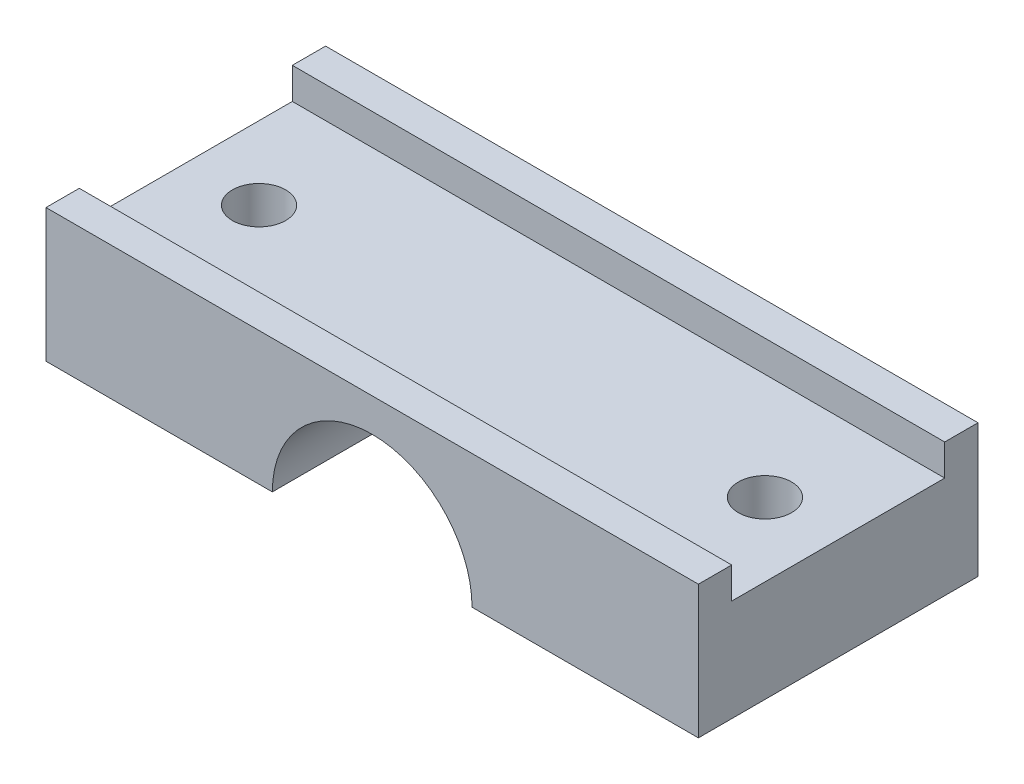
ISO-10303-21;
HEADER;
FILE_DESCRIPTION(('STEP AP214'),'2;1');
FILE_NAME('part.step','',(''),(''),'','','');
FILE_SCHEMA(('AUTOMOTIVE_DESIGN { 1 0 10303 214 1 1 1 1 }'));
ENDSEC;
DATA;
#1=APPLICATION_CONTEXT('core data for automotive mechanical design processes');
#2=APPLICATION_PROTOCOL_DEFINITION('international standard','automotive_design',2000,#1);
#3=PRODUCT_CONTEXT('',#1,'mechanical');
#4=PRODUCT('Part','Part','',(#3));
#5=PRODUCT_RELATED_PRODUCT_CATEGORY('part','',(#4));
#6=PRODUCT_DEFINITION_FORMATION('','',#4);
#7=PRODUCT_DEFINITION_CONTEXT('part definition',#1,'design');
#8=PRODUCT_DEFINITION('design','',#6,#7);
#9=PRODUCT_DEFINITION_SHAPE('','',#8);
#10=(LENGTH_UNIT() NAMED_UNIT(*) SI_UNIT(.MILLI.,.METRE.));
#11=(NAMED_UNIT(*) PLANE_ANGLE_UNIT() SI_UNIT($,.RADIAN.));
#12=(NAMED_UNIT(*) SI_UNIT($,.STERADIAN.) SOLID_ANGLE_UNIT());
#13=UNCERTAINTY_MEASURE_WITH_UNIT(LENGTH_MEASURE(1.E-05),#10,'distance_accuracy_value','');
#14=(GEOMETRIC_REPRESENTATION_CONTEXT(3) GLOBAL_UNCERTAINTY_ASSIGNED_CONTEXT((#13)) GLOBAL_UNIT_ASSIGNED_CONTEXT((#10,
#11,#12)) REPRESENTATION_CONTEXT('',''));
#15=CARTESIAN_POINT('',(0.,0.,0.));
#16=DIRECTION('',(0.,0.,1.));
#17=DIRECTION('',(1.,0.,0.));
#18=AXIS2_PLACEMENT_3D('',#15,#16,#17);
#19=CARTESIAN_POINT('',(0.,0.,42.));
#20=DIRECTION('',(0.,1.,0.));
#21=DIRECTION('',(0.,0.,1.));
#22=AXIS2_PLACEMENT_3D('',#19,#20,#21);
#23=PLANE('',#22);
#24=CARTESIAN_POINT('',(11.,0.,21.));
#25=DIRECTION('',(0.,1.,0.));
#26=DIRECTION('',(0.,0.,1.));
#27=AXIS2_PLACEMENT_3D('',#24,#25,#26);
#28=CIRCLE('',#27,4.);
#29=CARTESIAN_POINT('',(11.,0.,25.));
#30=VERTEX_POINT('',#29);
#31=EDGE_CURVE('E222',#30,#30,#28,.T.);
#32=ORIENTED_EDGE('',*,*,#31,.T.);
#33=EDGE_LOOP('',(#32));
#34=FACE_BOUND('',#33,.T.);
#35=DIRECTION('',(1.,0.,0.));
#36=VECTOR('',#35,1.);
#37=CARTESIAN_POINT('',(0.,0.,0.));
#38=LINE('',#37,#36);
#39=CARTESIAN_POINT('',(0.,0.,0.));
#40=VERTEX_POINT('',#39);
#41=CARTESIAN_POINT('',(34.,0.,0.));
#42=VERTEX_POINT('',#41);
#43=EDGE_CURVE('E140',#40,#42,#38,.T.);
#44=ORIENTED_EDGE('',*,*,#43,.T.);
#45=DIRECTION('',(0.,0.,1.));
#46=VECTOR('',#45,1.);
#47=CARTESIAN_POINT('',(34.,0.,0.));
#48=LINE('',#47,#46);
#49=CARTESIAN_POINT('',(34.,0.,42.));
#50=VERTEX_POINT('',#49);
#51=EDGE_CURVE('E54',#42,#50,#48,.T.);
#52=ORIENTED_EDGE('',*,*,#51,.T.);
#53=DIRECTION('',(1.,0.,0.));
#54=VECTOR('',#53,1.);
#55=CARTESIAN_POINT('',(0.,0.,42.));
#56=LINE('',#55,#54);
#57=CARTESIAN_POINT('',(0.,0.,42.));
#58=VERTEX_POINT('',#57);
#59=EDGE_CURVE('E179',#58,#50,#56,.T.);
#60=ORIENTED_EDGE('',*,*,#59,.F.);
#61=DIRECTION('',(0.,0.,-1.));
#62=VECTOR('',#61,1.);
#63=CARTESIAN_POINT('',(0.,0.,42.));
#64=LINE('',#63,#62);
#65=EDGE_CURVE('E11',#58,#40,#64,.T.);
#66=ORIENTED_EDGE('',*,*,#65,.T.);
#67=EDGE_LOOP('',(#44,#52,#60,#66));
#68=FACE_BOUND('',#67,.T.);
#69=ADVANCED_FACE('F38',(#34,#68),#23,.F.);
#70=CARTESIAN_POINT('',(64.,0.,42.));
#71=VERTEX_POINT('',#70);
#72=CARTESIAN_POINT('',(98.,0.,42.));
#73=VERTEX_POINT('',#72);
#74=EDGE_CURVE('E131',#71,#73,#56,.T.);
#75=ORIENTED_EDGE('',*,*,#74,.F.);
#76=DIRECTION('',(0.,0.,1.));
#77=VECTOR('',#76,1.);
#78=CARTESIAN_POINT('',(64.,0.,0.));
#79=LINE('',#78,#77);
#80=CARTESIAN_POINT('',(64.,0.,0.));
#81=VERTEX_POINT('',#80);
#82=EDGE_CURVE('E116',#71,#81,#79,.F.);
#83=ORIENTED_EDGE('',*,*,#82,.T.);
#84=CARTESIAN_POINT('',(98.,0.,0.));
#85=VERTEX_POINT('',#84);
#86=EDGE_CURVE('E129',#81,#85,#38,.T.);
#87=ORIENTED_EDGE('',*,*,#86,.T.);
#88=DIRECTION('',(0.,0.,-1.));
#89=VECTOR('',#88,1.);
#90=CARTESIAN_POINT('',(98.,0.,42.));
#91=LINE('',#90,#89);
#92=EDGE_CURVE('E47',#73,#85,#91,.T.);
#93=ORIENTED_EDGE('',*,*,#92,.F.);
#94=EDGE_LOOP('',(#75,#83,#87,#93));
#95=FACE_BOUND('',#94,.T.);
#96=CARTESIAN_POINT('',(87.,0.,21.));
#97=DIRECTION('',(0.,-1.,0.));
#98=DIRECTION('',(0.,0.,-1.));
#99=AXIS2_PLACEMENT_3D('',#96,#97,#98);
#100=CIRCLE('',#99,3.99999999999999);
#101=CARTESIAN_POINT('',(87.,0.,17.));
#102=VERTEX_POINT('',#101);
#103=EDGE_CURVE('E214',#102,#102,#100,.T.);
#104=ORIENTED_EDGE('',*,*,#103,.F.);
#105=EDGE_LOOP('',(#104));
#106=FACE_BOUND('',#105,.T.);
#107=ADVANCED_FACE('F126',(#95,#106),#23,.F.);
#108=CARTESIAN_POINT('',(0.,15.3,0.));
#109=DIRECTION('',(0.,-1.,0.));
#110=DIRECTION('',(0.,0.,-1.));
#111=AXIS2_PLACEMENT_3D('',#108,#109,#110);
#112=PLANE('',#111);
#113=CARTESIAN_POINT('',(11.,15.3,21.));
#114=DIRECTION('',(0.,1.,0.));
#115=DIRECTION('',(0.,0.,1.));
#116=AXIS2_PLACEMENT_3D('',#113,#114,#115);
#117=CIRCLE('',#116,4.);
#118=CARTESIAN_POINT('',(11.,15.3,25.));
#119=VERTEX_POINT('',#118);
#120=EDGE_CURVE('E226',#119,#119,#117,.T.);
#121=ORIENTED_EDGE('',*,*,#120,.F.);
#122=EDGE_LOOP('',(#121));
#123=FACE_BOUND('',#122,.T.);
#124=DIRECTION('',(0.,0.,-1.));
#125=VECTOR('',#124,1.);
#126=CARTESIAN_POINT('',(98.,15.3,0.));
#127=LINE('',#126,#125);
#128=CARTESIAN_POINT('',(98.,15.3,37.));
#129=VERTEX_POINT('',#128);
#130=CARTESIAN_POINT('',(98.,15.3,5.));
#131=VERTEX_POINT('',#130);
#132=EDGE_CURVE('E202',#129,#131,#127,.T.);
#133=ORIENTED_EDGE('',*,*,#132,.T.);
#134=DIRECTION('',(1.,0.,0.));
#135=VECTOR('',#134,1.);
#136=CARTESIAN_POINT('',(0.,15.3,5.));
#137=LINE('',#136,#135);
#138=CARTESIAN_POINT('',(0.,15.3,5.));
#139=VERTEX_POINT('',#138);
#140=EDGE_CURVE('E146',#139,#131,#137,.T.);
#141=ORIENTED_EDGE('',*,*,#140,.F.);
#142=DIRECTION('',(0.,0.,-1.));
#143=VECTOR('',#142,1.);
#144=CARTESIAN_POINT('',(0.,15.3,0.));
#145=LINE('',#144,#143);
#146=CARTESIAN_POINT('',(0.,15.3,37.));
#147=VERTEX_POINT('',#146);
#148=EDGE_CURVE('E194',#147,#139,#145,.T.);
#149=ORIENTED_EDGE('',*,*,#148,.F.);
#150=DIRECTION('',(1.,0.,0.));
#151=VECTOR('',#150,1.);
#152=CARTESIAN_POINT('',(0.,15.3,37.));
#153=LINE('',#152,#151);
#154=EDGE_CURVE('E197',#147,#129,#153,.T.);
#155=ORIENTED_EDGE('',*,*,#154,.T.);
#156=EDGE_LOOP('',(#133,#141,#149,#155));
#157=FACE_BOUND('',#156,.T.);
#158=CARTESIAN_POINT('',(87.,15.3,21.));
#159=DIRECTION('',(0.,-1.,0.));
#160=DIRECTION('',(0.,0.,-1.));
#161=AXIS2_PLACEMENT_3D('',#158,#159,#160);
#162=CIRCLE('',#161,3.99999999999999);
#163=CARTESIAN_POINT('',(87.,15.3,17.));
#164=VERTEX_POINT('',#163);
#165=EDGE_CURVE('E230',#164,#164,#162,.T.);
#166=ORIENTED_EDGE('',*,*,#165,.T.);
#167=EDGE_LOOP('',(#166));
#168=FACE_BOUND('',#167,.T.);
#169=ADVANCED_FACE('F259',(#123,#157,#168),#112,.F.);
#170=CARTESIAN_POINT('',(0.,0.,42.));
#171=DIRECTION('',(1.,0.,0.));
#172=DIRECTION('',(0.,0.,-1.));
#173=AXIS2_PLACEMENT_3D('',#170,#171,#172);
#174=PLANE('',#173);
#175=DIRECTION('',(0.,-1.,0.));
#176=VECTOR('',#175,1.);
#177=CARTESIAN_POINT('',(0.,0.,4.99999999999999));
#178=LINE('',#177,#176);
#179=CARTESIAN_POINT('',(0.,20.,5.));
#180=VERTEX_POINT('',#179);
#181=EDGE_CURVE('E206',#180,#139,#178,.T.);
#182=ORIENTED_EDGE('',*,*,#181,.F.);
#183=DIRECTION('',(0.,0.,-1.));
#184=VECTOR('',#183,1.);
#185=CARTESIAN_POINT('',(0.,20.,42.));
#186=LINE('',#185,#184);
#187=CARTESIAN_POINT('',(0.,20.,0.));
#188=VERTEX_POINT('',#187);
#189=EDGE_CURVE('E162',#180,#188,#186,.T.);
#190=ORIENTED_EDGE('',*,*,#189,.T.);
#191=DIRECTION('',(0.,-1.,0.));
#192=VECTOR('',#191,1.);
#193=CARTESIAN_POINT('',(0.,0.,0.));
#194=LINE('',#193,#192);
#195=EDGE_CURVE('E141',#188,#40,#194,.T.);
#196=ORIENTED_EDGE('',*,*,#195,.T.);
#197=ORIENTED_EDGE('',*,*,#65,.F.);
#198=DIRECTION('',(0.,-1.,0.));
#199=VECTOR('',#198,1.);
#200=CARTESIAN_POINT('',(0.,0.,42.));
#201=LINE('',#200,#199);
#202=CARTESIAN_POINT('',(0.,20.,42.));
#203=VERTEX_POINT('',#202);
#204=EDGE_CURVE('E156',#203,#58,#201,.T.);
#205=ORIENTED_EDGE('',*,*,#204,.F.);
#206=CARTESIAN_POINT('',(0.,20.,37.));
#207=VERTEX_POINT('',#206);
#208=EDGE_CURVE('E157',#203,#207,#186,.T.);
#209=ORIENTED_EDGE('',*,*,#208,.T.);
#210=DIRECTION('',(0.,-1.,0.));
#211=VECTOR('',#210,1.);
#212=CARTESIAN_POINT('',(0.,-1.09250669976412E-13,36.9999999999999));
#213=LINE('',#212,#211);
#214=EDGE_CURVE('E62',#207,#147,#213,.T.);
#215=ORIENTED_EDGE('',*,*,#214,.T.);
#216=ORIENTED_EDGE('',*,*,#148,.T.);
#217=EDGE_LOOP('',(#182,#190,#196,#197,#205,#209,#215,#216));
#218=FACE_BOUND('',#217,.T.);
#219=ADVANCED_FACE('F40',(#218),#174,.F.);
#220=CARTESIAN_POINT('',(98.,0.,42.));
#221=DIRECTION('',(-1.,0.,0.));
#222=DIRECTION('',(0.,0.,1.));
#223=AXIS2_PLACEMENT_3D('',#220,#221,#222);
#224=PLANE('',#223);
#225=DIRECTION('',(0.,-1.,0.));
#226=VECTOR('',#225,1.);
#227=CARTESIAN_POINT('',(98.,0.,4.99999999999999));
#228=LINE('',#227,#226);
#229=CARTESIAN_POINT('',(98.,20.,5.));
#230=VERTEX_POINT('',#229);
#231=EDGE_CURVE('E211',#230,#131,#228,.T.);
#232=ORIENTED_EDGE('',*,*,#231,.T.);
#233=ORIENTED_EDGE('',*,*,#132,.F.);
#234=DIRECTION('',(0.,-1.,0.));
#235=VECTOR('',#234,1.);
#236=CARTESIAN_POINT('',(98.,-1.09250669976412E-13,36.9999999999999));
#237=LINE('',#236,#235);
#238=CARTESIAN_POINT('',(98.,20.,37.));
#239=VERTEX_POINT('',#238);
#240=EDGE_CURVE('E207',#239,#129,#237,.T.);
#241=ORIENTED_EDGE('',*,*,#240,.F.);
#242=DIRECTION('',(0.,0.,-1.));
#243=VECTOR('',#242,1.);
#244=CARTESIAN_POINT('',(98.,20.,42.));
#245=LINE('',#244,#243);
#246=CARTESIAN_POINT('',(98.,20.,42.));
#247=VERTEX_POINT('',#246);
#248=EDGE_CURVE('E163',#247,#239,#245,.T.);
#249=ORIENTED_EDGE('',*,*,#248,.F.);
#250=DIRECTION('',(0.,1.,0.));
#251=VECTOR('',#250,1.);
#252=CARTESIAN_POINT('',(98.,0.,42.));
#253=LINE('',#252,#251);
#254=EDGE_CURVE('E173',#73,#247,#253,.T.);
#255=ORIENTED_EDGE('',*,*,#254,.F.);
#256=ORIENTED_EDGE('',*,*,#92,.T.);
#257=DIRECTION('',(0.,1.,0.));
#258=VECTOR('',#257,1.);
#259=CARTESIAN_POINT('',(98.,0.,0.));
#260=LINE('',#259,#258);
#261=CARTESIAN_POINT('',(98.,20.,0.));
#262=VERTEX_POINT('',#261);
#263=EDGE_CURVE('E138',#85,#262,#260,.T.);
#264=ORIENTED_EDGE('',*,*,#263,.T.);
#265=EDGE_CURVE('E161',#230,#262,#245,.T.);
#266=ORIENTED_EDGE('',*,*,#265,.F.);
#267=EDGE_LOOP('',(#232,#233,#241,#249,#255,#256,#264,#266));
#268=FACE_BOUND('',#267,.T.);
#269=ADVANCED_FACE('F170',(#268),#224,.F.);
#270=CARTESIAN_POINT('',(0.,20.,42.));
#271=DIRECTION('',(0.,-1.,0.));
#272=DIRECTION('',(0.,0.,-1.));
#273=AXIS2_PLACEMENT_3D('',#270,#271,#272);
#274=PLANE('',#273);
#275=DIRECTION('',(1.,0.,0.));
#276=VECTOR('',#275,1.);
#277=CARTESIAN_POINT('',(0.,20.,5.));
#278=LINE('',#277,#276);
#279=EDGE_CURVE('E189',#180,#230,#278,.T.);
#280=ORIENTED_EDGE('',*,*,#279,.T.);
#281=ORIENTED_EDGE('',*,*,#265,.T.);
#282=DIRECTION('',(-1.,0.,0.));
#283=VECTOR('',#282,1.);
#284=CARTESIAN_POINT('',(0.,20.,0.));
#285=LINE('',#284,#283);
#286=EDGE_CURVE('E152',#262,#188,#285,.T.);
#287=ORIENTED_EDGE('',*,*,#286,.T.);
#288=ORIENTED_EDGE('',*,*,#189,.F.);
#289=EDGE_LOOP('',(#280,#281,#287,#288));
#290=FACE_BOUND('',#289,.T.);
#291=ADVANCED_FACE('F250',(#290),#274,.F.);
#292=ORIENTED_EDGE('',*,*,#248,.T.);
#293=DIRECTION('',(1.,0.,0.));
#294=VECTOR('',#293,1.);
#295=CARTESIAN_POINT('',(0.,20.,37.));
#296=LINE('',#295,#294);
#297=EDGE_CURVE('E193',#207,#239,#296,.T.);
#298=ORIENTED_EDGE('',*,*,#297,.F.);
#299=ORIENTED_EDGE('',*,*,#208,.F.);
#300=DIRECTION('',(-1.,0.,0.));
#301=VECTOR('',#300,1.);
#302=CARTESIAN_POINT('',(0.,20.,42.));
#303=LINE('',#302,#301);
#304=EDGE_CURVE('E178',#247,#203,#303,.T.);
#305=ORIENTED_EDGE('',*,*,#304,.F.);
#306=EDGE_LOOP('',(#292,#298,#299,#305));
#307=FACE_BOUND('',#306,.T.);
#308=ADVANCED_FACE('F263',(#307),#274,.F.);
#309=CARTESIAN_POINT('',(0.,0.,42.));
#310=DIRECTION('',(0.,0.,-1.));
#311=DIRECTION('',(-1.,0.,0.));
#312=AXIS2_PLACEMENT_3D('',#309,#310,#311);
#313=PLANE('',#312);
#314=ORIENTED_EDGE('',*,*,#59,.T.);
#315=CARTESIAN_POINT('',(49.,0.,42.));
#316=DIRECTION('',(0.,0.,1.));
#317=DIRECTION('',(1.,0.,0.));
#318=AXIS2_PLACEMENT_3D('',#315,#316,#317);
#319=CIRCLE('',#318,15.);
#320=EDGE_CURVE('E122',#71,#50,#319,.T.);
#321=ORIENTED_EDGE('',*,*,#320,.F.);
#322=ORIENTED_EDGE('',*,*,#74,.T.);
#323=ORIENTED_EDGE('',*,*,#254,.T.);
#324=ORIENTED_EDGE('',*,*,#304,.T.);
#325=ORIENTED_EDGE('',*,*,#204,.T.);
#326=EDGE_LOOP('',(#314,#321,#322,#323,#324,#325));
#327=FACE_BOUND('',#326,.T.);
#328=ADVANCED_FACE('F241',(#327),#313,.F.);
#329=CARTESIAN_POINT('',(0.,0.,0.));
#330=DIRECTION('',(0.,0.,-1.));
#331=DIRECTION('',(-1.,0.,0.));
#332=AXIS2_PLACEMENT_3D('',#329,#330,#331);
#333=PLANE('',#332);
#334=CARTESIAN_POINT('',(49.,0.,0.));
#335=DIRECTION('',(0.,0.,1.));
#336=DIRECTION('',(1.,0.,0.));
#337=AXIS2_PLACEMENT_3D('',#334,#335,#336);
#338=CIRCLE('',#337,15.);
#339=EDGE_CURVE('E113',#81,#42,#338,.T.);
#340=ORIENTED_EDGE('',*,*,#339,.T.);
#341=ORIENTED_EDGE('',*,*,#43,.F.);
#342=ORIENTED_EDGE('',*,*,#195,.F.);
#343=ORIENTED_EDGE('',*,*,#286,.F.);
#344=ORIENTED_EDGE('',*,*,#263,.F.);
#345=ORIENTED_EDGE('',*,*,#86,.F.);
#346=EDGE_LOOP('',(#340,#341,#342,#343,#344,#345));
#347=FACE_BOUND('',#346,.T.);
#348=ADVANCED_FACE('F135',(#347),#333,.T.);
#349=CARTESIAN_POINT('',(0.,0.,4.99999999999999));
#350=DIRECTION('',(0.,0.,1.));
#351=DIRECTION('',(0.,-1.,0.));
#352=AXIS2_PLACEMENT_3D('',#349,#350,#351);
#353=PLANE('',#352);
#354=ORIENTED_EDGE('',*,*,#231,.F.);
#355=ORIENTED_EDGE('',*,*,#279,.F.);
#356=ORIENTED_EDGE('',*,*,#181,.T.);
#357=ORIENTED_EDGE('',*,*,#140,.T.);
#358=EDGE_LOOP('',(#354,#355,#356,#357));
#359=FACE_BOUND('',#358,.T.);
#360=ADVANCED_FACE('F255',(#359),#353,.T.);
#361=CARTESIAN_POINT('',(0.,-1.09250669976412E-13,36.9999999999999));
#362=DIRECTION('',(0.,0.,1.));
#363=DIRECTION('',(0.,-1.,0.));
#364=AXIS2_PLACEMENT_3D('',#361,#362,#363);
#365=PLANE('',#364);
#366=ORIENTED_EDGE('',*,*,#240,.T.);
#367=ORIENTED_EDGE('',*,*,#154,.F.);
#368=ORIENTED_EDGE('',*,*,#214,.F.);
#369=ORIENTED_EDGE('',*,*,#297,.T.);
#370=EDGE_LOOP('',(#366,#367,#368,#369));
#371=FACE_BOUND('',#370,.T.);
#372=ADVANCED_FACE('F261',(#371),#365,.F.);
#373=CARTESIAN_POINT('',(11.,0.,21.));
#374=DIRECTION('',(0.,1.,0.));
#375=DIRECTION('',(0.,0.,1.));
#376=AXIS2_PLACEMENT_3D('',#373,#374,#375);
#377=CYLINDRICAL_SURFACE('',#376,4.);
#378=ORIENTED_EDGE('',*,*,#31,.F.);
#379=EDGE_LOOP('',(#378));
#380=FACE_BOUND('',#379,.T.);
#381=ORIENTED_EDGE('',*,*,#120,.T.);
#382=EDGE_LOOP('',(#381));
#383=FACE_BOUND('',#382,.T.);
#384=ADVANCED_FACE('F292',(#380,#383),#377,.F.);
#385=CARTESIAN_POINT('',(87.,0.,21.));
#386=DIRECTION('',(0.,1.,0.));
#387=DIRECTION('',(0.,0.,1.));
#388=AXIS2_PLACEMENT_3D('',#385,#386,#387);
#389=CYLINDRICAL_SURFACE('',#388,3.99999999999999);
#390=ORIENTED_EDGE('',*,*,#103,.T.);
#391=EDGE_LOOP('',(#390));
#392=FACE_BOUND('',#391,.T.);
#393=ORIENTED_EDGE('',*,*,#165,.F.);
#394=EDGE_LOOP('',(#393));
#395=FACE_BOUND('',#394,.T.);
#396=ADVANCED_FACE('F317',(#392,#395),#389,.F.);
#397=CARTESIAN_POINT('',(49.,0.,0.));
#398=DIRECTION('',(0.,0.,1.));
#399=DIRECTION('',(1.,0.,0.));
#400=AXIS2_PLACEMENT_3D('',#397,#398,#399);
#401=CYLINDRICAL_SURFACE('',#400,15.);
#402=ORIENTED_EDGE('',*,*,#339,.F.);
#403=ORIENTED_EDGE('',*,*,#82,.F.);
#404=ORIENTED_EDGE('',*,*,#320,.T.);
#405=ORIENTED_EDGE('',*,*,#51,.F.);
#406=EDGE_LOOP('',(#402,#403,#404,#405));
#407=FACE_BOUND('',#406,.T.);
#408=ADVANCED_FACE('F115',(#407),#401,.F.);
#409=CLOSED_SHELL('',(#69,#107,#169,#219,#269,#291,#308,#328,#348,#360,#372,#384,#396,#408));
#410=MANIFOLD_SOLID_BREP('B2',#409);
#411=ADVANCED_BREP_SHAPE_REPRESENTATION('',(#18,#410),#14);
#412=SHAPE_DEFINITION_REPRESENTATION(#9,#411);
ENDSEC;
END-ISO-10303-21;
